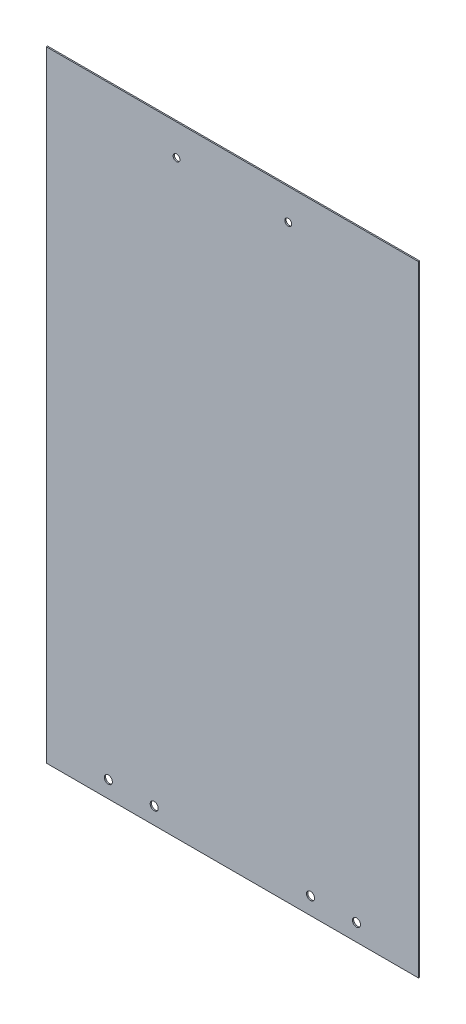
ISO-10303-21;
HEADER;
FILE_DESCRIPTION(('STEP AP214'),'2;1');
FILE_NAME('part.step','',(''),(''),'','','');
FILE_SCHEMA(('AUTOMOTIVE_DESIGN { 1 0 10303 214 1 1 1 1 }'));
ENDSEC;
DATA;
#1=APPLICATION_CONTEXT('core data for automotive mechanical design processes');
#2=APPLICATION_PROTOCOL_DEFINITION('international standard','automotive_design',2000,#1);
#3=PRODUCT_CONTEXT('',#1,'mechanical');
#4=PRODUCT('Part','Part','',(#3));
#5=PRODUCT_RELATED_PRODUCT_CATEGORY('part','',(#4));
#6=PRODUCT_DEFINITION_FORMATION('','',#4);
#7=PRODUCT_DEFINITION_CONTEXT('part definition',#1,'design');
#8=PRODUCT_DEFINITION('design','',#6,#7);
#9=PRODUCT_DEFINITION_SHAPE('','',#8);
#10=(LENGTH_UNIT() NAMED_UNIT(*) SI_UNIT(.MILLI.,.METRE.));
#11=(NAMED_UNIT(*) PLANE_ANGLE_UNIT() SI_UNIT($,.RADIAN.));
#12=(NAMED_UNIT(*) SI_UNIT($,.STERADIAN.) SOLID_ANGLE_UNIT());
#13=UNCERTAINTY_MEASURE_WITH_UNIT(LENGTH_MEASURE(1.E-05),#10,'distance_accuracy_value','');
#14=(GEOMETRIC_REPRESENTATION_CONTEXT(3) GLOBAL_UNCERTAINTY_ASSIGNED_CONTEXT((#13)) GLOBAL_UNIT_ASSIGNED_CONTEXT((#10,
#11,#12)) REPRESENTATION_CONTEXT('',''));
#15=CARTESIAN_POINT('',(0.,0.,0.));
#16=DIRECTION('',(0.,0.,1.));
#17=DIRECTION('',(1.,0.,0.));
#18=AXIS2_PLACEMENT_3D('',#15,#16,#17);
#19=CARTESIAN_POINT('',(325.,0.,0.9));
#20=DIRECTION('',(-1.,0.,0.));
#21=DIRECTION('',(0.,0.,1.));
#22=AXIS2_PLACEMENT_3D('',#19,#20,#21);
#23=PLANE('',#22);
#24=DIRECTION('',(0.,1.,0.));
#25=VECTOR('',#24,1.);
#26=CARTESIAN_POINT('',(325.,0.,-0.1));
#27=LINE('',#26,#25);
#28=CARTESIAN_POINT('',(325.,0.,-0.1));
#29=VERTEX_POINT('',#28);
#30=CARTESIAN_POINT('',(325.,500.,-0.1));
#31=VERTEX_POINT('',#30);
#32=EDGE_CURVE('E97',#29,#31,#27,.T.);
#33=ORIENTED_EDGE('',*,*,#32,.F.);
#34=DIRECTION('',(0.,0.,-1.));
#35=VECTOR('',#34,1.);
#36=CARTESIAN_POINT('',(325.,0.,0.9));
#37=LINE('',#36,#35);
#38=CARTESIAN_POINT('',(325.,0.,0.9));
#39=VERTEX_POINT('',#38);
#40=EDGE_CURVE('E11',#39,#29,#37,.T.);
#41=ORIENTED_EDGE('',*,*,#40,.F.);
#42=DIRECTION('',(0.,1.,0.));
#43=VECTOR('',#42,1.);
#44=CARTESIAN_POINT('',(325.,0.,0.9));
#45=LINE('',#44,#43);
#46=CARTESIAN_POINT('',(325.,500.,0.9));
#47=VERTEX_POINT('',#46);
#48=EDGE_CURVE('E90',#39,#47,#45,.T.);
#49=ORIENTED_EDGE('',*,*,#48,.T.);
#50=DIRECTION('',(0.,0.,-1.));
#51=VECTOR('',#50,1.);
#52=CARTESIAN_POINT('',(325.,500.,0.9));
#53=LINE('',#52,#51);
#54=EDGE_CURVE('E35',#47,#31,#53,.T.);
#55=ORIENTED_EDGE('',*,*,#54,.T.);
#56=EDGE_LOOP('',(#33,#41,#49,#55));
#57=FACE_BOUND('',#56,.T.);
#58=ADVANCED_FACE('F32',(#57),#23,.T.);
#59=CARTESIAN_POINT('',(625.,0.,0.9));
#60=DIRECTION('',(0.,-1.,0.));
#61=DIRECTION('',(0.,0.,-1.));
#62=AXIS2_PLACEMENT_3D('',#59,#60,#61);
#63=PLANE('',#62);
#64=DIRECTION('',(-1.,0.,0.));
#65=VECTOR('',#64,1.);
#66=CARTESIAN_POINT('',(625.,0.,-0.1));
#67=LINE('',#66,#65);
#68=CARTESIAN_POINT('',(625.,0.,-0.1));
#69=VERTEX_POINT('',#68);
#70=EDGE_CURVE('E92',#69,#29,#67,.T.);
#71=ORIENTED_EDGE('',*,*,#70,.F.);
#72=DIRECTION('',(0.,0.,-1.));
#73=VECTOR('',#72,1.);
#74=CARTESIAN_POINT('',(625.,0.,0.9));
#75=LINE('',#74,#73);
#76=CARTESIAN_POINT('',(625.,0.,0.9));
#77=VERTEX_POINT('',#76);
#78=EDGE_CURVE('E41',#77,#69,#75,.T.);
#79=ORIENTED_EDGE('',*,*,#78,.F.);
#80=DIRECTION('',(-1.,0.,0.));
#81=VECTOR('',#80,1.);
#82=CARTESIAN_POINT('',(625.,0.,0.9));
#83=LINE('',#82,#81);
#84=EDGE_CURVE('E87',#77,#39,#83,.T.);
#85=ORIENTED_EDGE('',*,*,#84,.T.);
#86=ORIENTED_EDGE('',*,*,#40,.T.);
#87=EDGE_LOOP('',(#71,#79,#85,#86));
#88=FACE_BOUND('',#87,.T.);
#89=ADVANCED_FACE('F108',(#88),#63,.T.);
#90=CARTESIAN_POINT('',(625.,500.,0.9));
#91=DIRECTION('',(1.,0.,0.));
#92=DIRECTION('',(0.,0.,-1.));
#93=AXIS2_PLACEMENT_3D('',#90,#91,#92);
#94=PLANE('',#93);
#95=DIRECTION('',(0.,-1.,0.));
#96=VECTOR('',#95,1.);
#97=CARTESIAN_POINT('',(625.,500.,-0.1));
#98=LINE('',#97,#96);
#99=CARTESIAN_POINT('',(625.,500.,-0.1));
#100=VERTEX_POINT('',#99);
#101=EDGE_CURVE('E82',#100,#69,#98,.T.);
#102=ORIENTED_EDGE('',*,*,#101,.F.);
#103=DIRECTION('',(0.,0.,-1.));
#104=VECTOR('',#103,1.);
#105=CARTESIAN_POINT('',(625.,500.,0.9));
#106=LINE('',#105,#104);
#107=CARTESIAN_POINT('',(625.,500.,0.9));
#108=VERTEX_POINT('',#107);
#109=EDGE_CURVE('E77',#108,#100,#106,.T.);
#110=ORIENTED_EDGE('',*,*,#109,.F.);
#111=DIRECTION('',(0.,-1.,0.));
#112=VECTOR('',#111,1.);
#113=CARTESIAN_POINT('',(625.,500.,0.9));
#114=LINE('',#113,#112);
#115=EDGE_CURVE('E80',#108,#77,#114,.T.);
#116=ORIENTED_EDGE('',*,*,#115,.T.);
#117=ORIENTED_EDGE('',*,*,#78,.T.);
#118=EDGE_LOOP('',(#102,#110,#116,#117));
#119=FACE_BOUND('',#118,.T.);
#120=ADVANCED_FACE('F79',(#119),#94,.T.);
#121=CARTESIAN_POINT('',(325.,500.,0.9));
#122=DIRECTION('',(0.,1.,0.));
#123=DIRECTION('',(-1.,0.,0.));
#124=AXIS2_PLACEMENT_3D('',#121,#122,#123);
#125=PLANE('',#124);
#126=DIRECTION('',(1.,0.,0.));
#127=VECTOR('',#126,1.);
#128=CARTESIAN_POINT('',(325.,500.,-0.1));
#129=LINE('',#128,#127);
#130=EDGE_CURVE('E100',#31,#100,#129,.T.);
#131=ORIENTED_EDGE('',*,*,#130,.F.);
#132=ORIENTED_EDGE('',*,*,#54,.F.);
#133=DIRECTION('',(1.,0.,0.));
#134=VECTOR('',#133,1.);
#135=CARTESIAN_POINT('',(325.,500.,0.9));
#136=LINE('',#135,#134);
#137=EDGE_CURVE('E86',#47,#108,#136,.T.);
#138=ORIENTED_EDGE('',*,*,#137,.T.);
#139=ORIENTED_EDGE('',*,*,#109,.T.);
#140=EDGE_LOOP('',(#131,#132,#138,#139));
#141=FACE_BOUND('',#140,.T.);
#142=ADVANCED_FACE('F89',(#141),#125,.T.);
#143=CARTESIAN_POINT('',(0.,0.,0.9));
#144=DIRECTION('',(0.,0.,-1.));
#145=DIRECTION('',(-1.,0.,0.));
#146=AXIS2_PLACEMENT_3D('',#143,#144,#145);
#147=PLANE('',#146);
#148=CARTESIAN_POINT('',(412.,13.5,0.9));
#149=DIRECTION('',(0.,0.,-1.));
#150=DIRECTION('',(-1.,0.,0.));
#151=AXIS2_PLACEMENT_3D('',#148,#149,#150);
#152=CIRCLE('',#151,3.24999999999998);
#153=CARTESIAN_POINT('',(408.75,13.5,0.9));
#154=VERTEX_POINT('',#153);
#155=EDGE_CURVE('E157',#154,#154,#152,.T.);
#156=ORIENTED_EDGE('',*,*,#155,.T.);
#157=EDGE_LOOP('',(#156));
#158=FACE_BOUND('',#157,.T.);
#159=CARTESIAN_POINT('',(375.,13.5,0.9));
#160=DIRECTION('',(0.,0.,-1.));
#161=DIRECTION('',(-1.,0.,0.));
#162=AXIS2_PLACEMENT_3D('',#159,#160,#161);
#163=CIRCLE('',#162,3.24999999999998);
#164=CARTESIAN_POINT('',(371.75,13.5,0.9));
#165=VERTEX_POINT('',#164);
#166=EDGE_CURVE('E167',#165,#165,#163,.T.);
#167=ORIENTED_EDGE('',*,*,#166,.T.);
#168=EDGE_LOOP('',(#167));
#169=FACE_BOUND('',#168,.T.);
#170=CARTESIAN_POINT('',(430.,475.,0.9));
#171=DIRECTION('',(0.,0.,-1.));
#172=DIRECTION('',(-1.,0.,0.));
#173=AXIS2_PLACEMENT_3D('',#170,#171,#172);
#174=CIRCLE('',#173,2.74999999999998);
#175=CARTESIAN_POINT('',(427.25,475.,0.9));
#176=VERTEX_POINT('',#175);
#177=EDGE_CURVE('E171',#176,#176,#174,.T.);
#178=ORIENTED_EDGE('',*,*,#177,.T.);
#179=EDGE_LOOP('',(#178));
#180=FACE_BOUND('',#179,.T.);
#181=CARTESIAN_POINT('',(520.,475.,0.9));
#182=DIRECTION('',(0.,0.,-1.));
#183=DIRECTION('',(-1.,0.,0.));
#184=AXIS2_PLACEMENT_3D('',#181,#182,#183);
#185=CIRCLE('',#184,2.75000000000004);
#186=CARTESIAN_POINT('',(517.25,475.,0.9));
#187=VERTEX_POINT('',#186);
#188=EDGE_CURVE('E177',#187,#187,#185,.T.);
#189=ORIENTED_EDGE('',*,*,#188,.T.);
#190=EDGE_LOOP('',(#189));
#191=FACE_BOUND('',#190,.T.);
#192=CARTESIAN_POINT('',(575.,13.75,0.9));
#193=DIRECTION('',(0.,0.,-1.));
#194=DIRECTION('',(-1.,0.,0.));
#195=AXIS2_PLACEMENT_3D('',#192,#193,#194);
#196=CIRCLE('',#195,3.25000000007761);
#197=CARTESIAN_POINT('',(571.749999999922,13.75,0.9));
#198=VERTEX_POINT('',#197);
#199=EDGE_CURVE('E183',#198,#198,#196,.T.);
#200=ORIENTED_EDGE('',*,*,#199,.T.);
#201=EDGE_LOOP('',(#200));
#202=FACE_BOUND('',#201,.T.);
#203=CARTESIAN_POINT('',(538.,13.75,0.9));
#204=DIRECTION('',(0.,0.,-1.));
#205=DIRECTION('',(-1.,0.,0.));
#206=AXIS2_PLACEMENT_3D('',#203,#204,#205);
#207=CIRCLE('',#206,3.25000000007761);
#208=CARTESIAN_POINT('',(534.749999999922,13.75,0.9));
#209=VERTEX_POINT('',#208);
#210=EDGE_CURVE('E101',#209,#209,#207,.T.);
#211=ORIENTED_EDGE('',*,*,#210,.T.);
#212=EDGE_LOOP('',(#211));
#213=FACE_BOUND('',#212,.T.);
#214=ORIENTED_EDGE('',*,*,#48,.F.);
#215=ORIENTED_EDGE('',*,*,#84,.F.);
#216=ORIENTED_EDGE('',*,*,#115,.F.);
#217=ORIENTED_EDGE('',*,*,#137,.F.);
#218=EDGE_LOOP('',(#214,#215,#216,#217));
#219=FACE_BOUND('',#218,.T.);
#220=ADVANCED_FACE('F85',(#158,#169,#180,#191,#202,#213,#219),#147,.F.);
#221=CARTESIAN_POINT('',(0.,0.,-0.1));
#222=DIRECTION('',(0.,0.,-1.));
#223=DIRECTION('',(-1.,0.,0.));
#224=AXIS2_PLACEMENT_3D('',#221,#222,#223);
#225=PLANE('',#224);
#226=CARTESIAN_POINT('',(412.,13.5,-0.100000000000001));
#227=DIRECTION('',(0.,0.,-1.));
#228=DIRECTION('',(-1.,0.,0.));
#229=AXIS2_PLACEMENT_3D('',#226,#227,#228);
#230=CIRCLE('',#229,3.24999999999998);
#231=CARTESIAN_POINT('',(408.75,13.5,-0.100000000000001));
#232=VERTEX_POINT('',#231);
#233=EDGE_CURVE('E160',#232,#232,#230,.T.);
#234=ORIENTED_EDGE('',*,*,#233,.F.);
#235=EDGE_LOOP('',(#234));
#236=FACE_BOUND('',#235,.T.);
#237=CARTESIAN_POINT('',(375.,13.5,-0.100000000000001));
#238=DIRECTION('',(0.,0.,-1.));
#239=DIRECTION('',(-1.,0.,0.));
#240=AXIS2_PLACEMENT_3D('',#237,#238,#239);
#241=CIRCLE('',#240,3.24999999999998);
#242=CARTESIAN_POINT('',(371.75,13.5,-0.100000000000001));
#243=VERTEX_POINT('',#242);
#244=EDGE_CURVE('E162',#243,#243,#241,.T.);
#245=ORIENTED_EDGE('',*,*,#244,.F.);
#246=EDGE_LOOP('',(#245));
#247=FACE_BOUND('',#246,.T.);
#248=CARTESIAN_POINT('',(430.,475.,-0.1));
#249=DIRECTION('',(0.,0.,-1.));
#250=DIRECTION('',(-1.,0.,0.));
#251=AXIS2_PLACEMENT_3D('',#248,#249,#250);
#252=CIRCLE('',#251,2.74999999999998);
#253=CARTESIAN_POINT('',(427.25,475.,-0.1));
#254=VERTEX_POINT('',#253);
#255=EDGE_CURVE('E170',#254,#254,#252,.T.);
#256=ORIENTED_EDGE('',*,*,#255,.F.);
#257=EDGE_LOOP('',(#256));
#258=FACE_BOUND('',#257,.T.);
#259=CARTESIAN_POINT('',(520.,475.,-0.1));
#260=DIRECTION('',(0.,0.,-1.));
#261=DIRECTION('',(-1.,0.,0.));
#262=AXIS2_PLACEMENT_3D('',#259,#260,#261);
#263=CIRCLE('',#262,2.75000000000004);
#264=CARTESIAN_POINT('',(517.25,475.,-0.1));
#265=VERTEX_POINT('',#264);
#266=EDGE_CURVE('E174',#265,#265,#263,.T.);
#267=ORIENTED_EDGE('',*,*,#266,.F.);
#268=EDGE_LOOP('',(#267));
#269=FACE_BOUND('',#268,.T.);
#270=CARTESIAN_POINT('',(575.,13.75,-0.1));
#271=DIRECTION('',(0.,0.,-1.));
#272=DIRECTION('',(-1.,0.,0.));
#273=AXIS2_PLACEMENT_3D('',#270,#271,#272);
#274=CIRCLE('',#273,3.25000000007761);
#275=CARTESIAN_POINT('',(571.749999999922,13.75,-0.1));
#276=VERTEX_POINT('',#275);
#277=EDGE_CURVE('E180',#276,#276,#274,.T.);
#278=ORIENTED_EDGE('',*,*,#277,.F.);
#279=EDGE_LOOP('',(#278));
#280=FACE_BOUND('',#279,.T.);
#281=CARTESIAN_POINT('',(538.,13.75,-0.1));
#282=DIRECTION('',(0.,0.,-1.));
#283=DIRECTION('',(-1.,0.,0.));
#284=AXIS2_PLACEMENT_3D('',#281,#282,#283);
#285=CIRCLE('',#284,3.25000000007761);
#286=CARTESIAN_POINT('',(534.749999999922,13.75,-0.1));
#287=VERTEX_POINT('',#286);
#288=EDGE_CURVE('E186',#287,#287,#285,.T.);
#289=ORIENTED_EDGE('',*,*,#288,.F.);
#290=EDGE_LOOP('',(#289));
#291=FACE_BOUND('',#290,.T.);
#292=ORIENTED_EDGE('',*,*,#32,.T.);
#293=ORIENTED_EDGE('',*,*,#130,.T.);
#294=ORIENTED_EDGE('',*,*,#101,.T.);
#295=ORIENTED_EDGE('',*,*,#70,.T.);
#296=EDGE_LOOP('',(#292,#293,#294,#295));
#297=FACE_BOUND('',#296,.T.);
#298=ADVANCED_FACE('F107',(#236,#247,#258,#269,#280,#291,#297),#225,.T.);
#299=CARTESIAN_POINT('',(538.,13.75,0.9));
#300=DIRECTION('',(0.,0.,-1.));
#301=DIRECTION('',(-1.,0.,0.));
#302=AXIS2_PLACEMENT_3D('',#299,#300,#301);
#303=CYLINDRICAL_SURFACE('',#302,3.25000000007761);
#304=ORIENTED_EDGE('',*,*,#210,.F.);
#305=EDGE_LOOP('',(#304));
#306=FACE_BOUND('',#305,.T.);
#307=ORIENTED_EDGE('',*,*,#288,.T.);
#308=EDGE_LOOP('',(#307));
#309=FACE_BOUND('',#308,.T.);
#310=ADVANCED_FACE('F126',(#306,#309),#303,.F.);
#311=CARTESIAN_POINT('',(575.,13.75,0.9));
#312=DIRECTION('',(0.,0.,-1.));
#313=DIRECTION('',(-1.,0.,0.));
#314=AXIS2_PLACEMENT_3D('',#311,#312,#313);
#315=CYLINDRICAL_SURFACE('',#314,3.25000000007761);
#316=ORIENTED_EDGE('',*,*,#199,.F.);
#317=EDGE_LOOP('',(#316));
#318=FACE_BOUND('',#317,.T.);
#319=ORIENTED_EDGE('',*,*,#277,.T.);
#320=EDGE_LOOP('',(#319));
#321=FACE_BOUND('',#320,.T.);
#322=ADVANCED_FACE('F133',(#318,#321),#315,.F.);
#323=CARTESIAN_POINT('',(520.,475.,0.9));
#324=DIRECTION('',(0.,0.,-1.));
#325=DIRECTION('',(-1.,0.,0.));
#326=AXIS2_PLACEMENT_3D('',#323,#324,#325);
#327=CYLINDRICAL_SURFACE('',#326,2.75000000000004);
#328=ORIENTED_EDGE('',*,*,#188,.F.);
#329=EDGE_LOOP('',(#328));
#330=FACE_BOUND('',#329,.T.);
#331=ORIENTED_EDGE('',*,*,#266,.T.);
#332=EDGE_LOOP('',(#331));
#333=FACE_BOUND('',#332,.T.);
#334=ADVANCED_FACE('F137',(#330,#333),#327,.F.);
#335=CARTESIAN_POINT('',(430.,475.,0.9));
#336=DIRECTION('',(0.,0.,-1.));
#337=DIRECTION('',(-1.,0.,0.));
#338=AXIS2_PLACEMENT_3D('',#335,#336,#337);
#339=CYLINDRICAL_SURFACE('',#338,2.74999999999998);
#340=ORIENTED_EDGE('',*,*,#177,.F.);
#341=EDGE_LOOP('',(#340));
#342=FACE_BOUND('',#341,.T.);
#343=ORIENTED_EDGE('',*,*,#255,.T.);
#344=EDGE_LOOP('',(#343));
#345=FACE_BOUND('',#344,.T.);
#346=ADVANCED_FACE('F141',(#342,#345),#339,.F.);
#347=CARTESIAN_POINT('',(375.,13.5,-0.1));
#348=DIRECTION('',(0.,0.,-1.));
#349=DIRECTION('',(-1.,0.,0.));
#350=AXIS2_PLACEMENT_3D('',#347,#348,#349);
#351=CYLINDRICAL_SURFACE('',#350,3.24999999999998);
#352=ORIENTED_EDGE('',*,*,#166,.F.);
#353=EDGE_LOOP('',(#352));
#354=FACE_BOUND('',#353,.T.);
#355=ORIENTED_EDGE('',*,*,#244,.T.);
#356=EDGE_LOOP('',(#355));
#357=FACE_BOUND('',#356,.T.);
#358=ADVANCED_FACE('F145',(#354,#357),#351,.F.);
#359=CARTESIAN_POINT('',(412.,13.5,-0.1));
#360=DIRECTION('',(0.,0.,-1.));
#361=DIRECTION('',(-1.,0.,0.));
#362=AXIS2_PLACEMENT_3D('',#359,#360,#361);
#363=CYLINDRICAL_SURFACE('',#362,3.24999999999998);
#364=ORIENTED_EDGE('',*,*,#155,.F.);
#365=EDGE_LOOP('',(#364));
#366=FACE_BOUND('',#365,.T.);
#367=ORIENTED_EDGE('',*,*,#233,.T.);
#368=EDGE_LOOP('',(#367));
#369=FACE_BOUND('',#368,.T.);
#370=ADVANCED_FACE('F149',(#366,#369),#363,.F.);
#371=CLOSED_SHELL('',(#58,#89,#120,#142,#220,#298,#310,#322,#334,#346,#358,#370));
#372=MANIFOLD_SOLID_BREP('B2',#371);
#373=ADVANCED_BREP_SHAPE_REPRESENTATION('',(#18,#372),#14);
#374=SHAPE_DEFINITION_REPRESENTATION(#9,#373);
ENDSEC;
END-ISO-10303-21;
